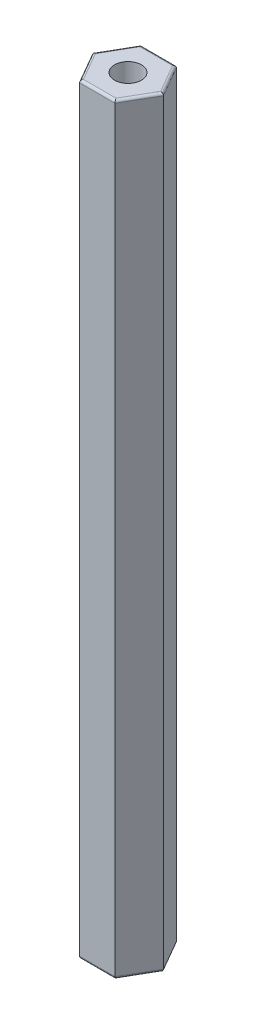
ISO-10303-21;
HEADER;
FILE_DESCRIPTION(('STEP AP214'),'2;1');
FILE_NAME('part.step','',(''),(''),'','','');
FILE_SCHEMA(('AUTOMOTIVE_DESIGN { 1 0 10303 214 1 1 1 1 }'));
ENDSEC;
DATA;
#1=APPLICATION_CONTEXT('core data for automotive mechanical design processes');
#2=APPLICATION_PROTOCOL_DEFINITION('international standard','automotive_design',2000,#1);
#3=PRODUCT_CONTEXT('',#1,'mechanical');
#4=PRODUCT('Part','Part','',(#3));
#5=PRODUCT_RELATED_PRODUCT_CATEGORY('part','',(#4));
#6=PRODUCT_DEFINITION_FORMATION('','',#4);
#7=PRODUCT_DEFINITION_CONTEXT('part definition',#1,'design');
#8=PRODUCT_DEFINITION('design','',#6,#7);
#9=PRODUCT_DEFINITION_SHAPE('','',#8);
#10=(LENGTH_UNIT() NAMED_UNIT(*) SI_UNIT(.MILLI.,.METRE.));
#11=(NAMED_UNIT(*) PLANE_ANGLE_UNIT() SI_UNIT($,.RADIAN.));
#12=(NAMED_UNIT(*) SI_UNIT($,.STERADIAN.) SOLID_ANGLE_UNIT());
#13=UNCERTAINTY_MEASURE_WITH_UNIT(LENGTH_MEASURE(1.E-05),#10,'distance_accuracy_value','');
#14=(GEOMETRIC_REPRESENTATION_CONTEXT(3) GLOBAL_UNCERTAINTY_ASSIGNED_CONTEXT((#13)) GLOBAL_UNIT_ASSIGNED_CONTEXT((#10,
#11,#12)) REPRESENTATION_CONTEXT('',''));
#15=CARTESIAN_POINT('',(0.,0.,0.));
#16=DIRECTION('',(0.,0.,1.));
#17=DIRECTION('',(1.,0.,0.));
#18=AXIS2_PLACEMENT_3D('',#15,#16,#17);
#19=CARTESIAN_POINT('',(1.44337567297406,62.,2.5));
#20=DIRECTION('',(-0.866025403784439,0.,-0.5));
#21=DIRECTION('',(-0.5,0.,0.866025403784439));
#22=AXIS2_PLACEMENT_3D('',#19,#20,#21);
#23=PLANE('',#22);
#24=DIRECTION('',(0.,-1.,0.));
#25=VECTOR('',#24,1.);
#26=CARTESIAN_POINT('',(2.88675134594813,62.,0.));
#27=LINE('',#26,#25);
#28=CARTESIAN_POINT('',(2.88675134594813,61.8,0.));
#29=VERTEX_POINT('',#28);
#30=CARTESIAN_POINT('',(2.88675134594813,0.200000000000006,0.));
#31=VERTEX_POINT('',#30);
#32=EDGE_CURVE('E151',#29,#31,#27,.T.);
#33=ORIENTED_EDGE('',*,*,#32,.F.);
#34=DIRECTION('',(0.5,0.,-0.866025403784439));
#35=VECTOR('',#34,1.);
#36=CARTESIAN_POINT('',(1.44337567297406,61.8,2.5));
#37=LINE('',#36,#35);
#38=CARTESIAN_POINT('',(1.44337567297406,61.8,2.5));
#39=VERTEX_POINT('',#38);
#40=EDGE_CURVE('E142',#29,#39,#37,.F.);
#41=ORIENTED_EDGE('',*,*,#40,.T.);
#42=DIRECTION('',(0.,-1.,0.));
#43=VECTOR('',#42,1.);
#44=CARTESIAN_POINT('',(1.44337567297406,62.,2.5));
#45=LINE('',#44,#43);
#46=CARTESIAN_POINT('',(1.44337567297406,0.200000000000006,2.5));
#47=VERTEX_POINT('',#46);
#48=EDGE_CURVE('E208',#39,#47,#45,.T.);
#49=ORIENTED_EDGE('',*,*,#48,.T.);
#50=DIRECTION('',(0.5,0.,-0.866025403784439));
#51=VECTOR('',#50,1.);
#52=CARTESIAN_POINT('',(1.44337567297406,0.199999999999999,2.5));
#53=LINE('',#52,#51);
#54=EDGE_CURVE('E183',#47,#31,#53,.T.);
#55=ORIENTED_EDGE('',*,*,#54,.T.);
#56=EDGE_LOOP('',(#33,#41,#49,#55));
#57=FACE_BOUND('',#56,.T.);
#58=ADVANCED_FACE('F35',(#57),#23,.F.);
#59=CARTESIAN_POINT('',(2.88675134594813,62.,0.));
#60=DIRECTION('',(-0.866025403784439,0.,0.5));
#61=DIRECTION('',(0.5,0.,0.866025403784439));
#62=AXIS2_PLACEMENT_3D('',#59,#60,#61);
#63=PLANE('',#62);
#64=DIRECTION('',(0.,-1.,0.));
#65=VECTOR('',#64,1.);
#66=CARTESIAN_POINT('',(1.44337567297406,62.,-2.5));
#67=LINE('',#66,#65);
#68=CARTESIAN_POINT('',(1.44337567297406,61.8,-2.5));
#69=VERTEX_POINT('',#68);
#70=CARTESIAN_POINT('',(1.44337567297406,0.200000000000006,-2.5));
#71=VERTEX_POINT('',#70);
#72=EDGE_CURVE('E154',#69,#71,#67,.T.);
#73=ORIENTED_EDGE('',*,*,#72,.F.);
#74=DIRECTION('',(-0.5,0.,-0.866025403784439));
#75=VECTOR('',#74,1.);
#76=CARTESIAN_POINT('',(2.88675134594813,61.8,0.));
#77=LINE('',#76,#75);
#78=EDGE_CURVE('E188',#69,#29,#77,.F.);
#79=ORIENTED_EDGE('',*,*,#78,.T.);
#80=ORIENTED_EDGE('',*,*,#32,.T.);
#81=DIRECTION('',(-0.5,0.,-0.866025403784439));
#82=VECTOR('',#81,1.);
#83=CARTESIAN_POINT('',(2.88675134594813,0.199999999999999,0.));
#84=LINE('',#83,#82);
#85=EDGE_CURVE('E186',#31,#71,#84,.T.);
#86=ORIENTED_EDGE('',*,*,#85,.T.);
#87=EDGE_LOOP('',(#73,#79,#80,#86));
#88=FACE_BOUND('',#87,.T.);
#89=ADVANCED_FACE('F270',(#88),#63,.F.);
#90=CARTESIAN_POINT('',(1.44337567297406,62.,-2.5));
#91=DIRECTION('',(0.,0.,1.));
#92=DIRECTION('',(1.,0.,0.));
#93=AXIS2_PLACEMENT_3D('',#90,#91,#92);
#94=PLANE('',#93);
#95=DIRECTION('',(0.,-1.,0.));
#96=VECTOR('',#95,1.);
#97=CARTESIAN_POINT('',(-1.44337567297406,62.,-2.5));
#98=LINE('',#97,#96);
#99=CARTESIAN_POINT('',(-1.44337567297406,61.8,-2.5));
#100=VERTEX_POINT('',#99);
#101=CARTESIAN_POINT('',(-1.44337567297406,0.200000000000006,-2.5));
#102=VERTEX_POINT('',#101);
#103=EDGE_CURVE('E261',#100,#102,#98,.T.);
#104=ORIENTED_EDGE('',*,*,#103,.F.);
#105=DIRECTION('',(-1.,0.,0.));
#106=VECTOR('',#105,1.);
#107=CARTESIAN_POINT('',(1.44337567297406,61.8,-2.5));
#108=LINE('',#107,#106);
#109=EDGE_CURVE('E167',#100,#69,#108,.F.);
#110=ORIENTED_EDGE('',*,*,#109,.T.);
#111=ORIENTED_EDGE('',*,*,#72,.T.);
#112=DIRECTION('',(-1.,0.,0.));
#113=VECTOR('',#112,1.);
#114=CARTESIAN_POINT('',(1.44337567297406,0.199999999999999,-2.5));
#115=LINE('',#114,#113);
#116=EDGE_CURVE('E165',#71,#102,#115,.T.);
#117=ORIENTED_EDGE('',*,*,#116,.T.);
#118=EDGE_LOOP('',(#104,#110,#111,#117));
#119=FACE_BOUND('',#118,.T.);
#120=ADVANCED_FACE('F267',(#119),#94,.F.);
#121=CARTESIAN_POINT('',(-1.44337567297406,62.,-2.5));
#122=DIRECTION('',(0.866025403784439,0.,0.5));
#123=DIRECTION('',(0.5,0.,-0.866025403784439));
#124=AXIS2_PLACEMENT_3D('',#121,#122,#123);
#125=PLANE('',#124);
#126=DIRECTION('',(0.,-1.,0.));
#127=VECTOR('',#126,1.);
#128=CARTESIAN_POINT('',(-2.88675134594813,62.,0.));
#129=LINE('',#128,#127);
#130=CARTESIAN_POINT('',(-2.88675134594813,61.8,0.));
#131=VERTEX_POINT('',#130);
#132=CARTESIAN_POINT('',(-2.88675134594813,0.200000000000006,0.));
#133=VERTEX_POINT('',#132);
#134=EDGE_CURVE('E253',#131,#133,#129,.T.);
#135=ORIENTED_EDGE('',*,*,#134,.F.);
#136=DIRECTION('',(-0.5,0.,0.866025403784439));
#137=VECTOR('',#136,1.);
#138=CARTESIAN_POINT('',(-1.44337567297406,61.8,-2.5));
#139=LINE('',#138,#137);
#140=EDGE_CURVE('E172',#131,#100,#139,.F.);
#141=ORIENTED_EDGE('',*,*,#140,.T.);
#142=ORIENTED_EDGE('',*,*,#103,.T.);
#143=DIRECTION('',(-0.5,0.,0.866025403784439));
#144=VECTOR('',#143,1.);
#145=CARTESIAN_POINT('',(-1.44337567297406,0.199999999999999,-2.5));
#146=LINE('',#145,#144);
#147=EDGE_CURVE('E170',#102,#133,#146,.T.);
#148=ORIENTED_EDGE('',*,*,#147,.T.);
#149=EDGE_LOOP('',(#135,#141,#142,#148));
#150=FACE_BOUND('',#149,.T.);
#151=ADVANCED_FACE('F277',(#150),#125,.F.);
#152=CARTESIAN_POINT('',(-2.88675134594813,62.,0.));
#153=DIRECTION('',(0.866025403784439,0.,-0.5));
#154=DIRECTION('',(-0.5,0.,-0.866025403784439));
#155=AXIS2_PLACEMENT_3D('',#152,#153,#154);
#156=PLANE('',#155);
#157=DIRECTION('',(0.,-1.,0.));
#158=VECTOR('',#157,1.);
#159=CARTESIAN_POINT('',(-1.44337567297406,62.,2.5));
#160=LINE('',#159,#158);
#161=CARTESIAN_POINT('',(-1.44337567297406,61.8,2.5));
#162=VERTEX_POINT('',#161);
#163=CARTESIAN_POINT('',(-1.44337567297406,0.200000000000006,2.5));
#164=VERTEX_POINT('',#163);
#165=EDGE_CURVE('E249',#162,#164,#160,.T.);
#166=ORIENTED_EDGE('',*,*,#165,.F.);
#167=DIRECTION('',(0.5,0.,0.866025403784439));
#168=VECTOR('',#167,1.);
#169=CARTESIAN_POINT('',(-2.88675134594813,61.8,0.));
#170=LINE('',#169,#168);
#171=EDGE_CURVE('E176',#162,#131,#170,.F.);
#172=ORIENTED_EDGE('',*,*,#171,.T.);
#173=ORIENTED_EDGE('',*,*,#134,.T.);
#174=DIRECTION('',(0.5,0.,0.866025403784439));
#175=VECTOR('',#174,1.);
#176=CARTESIAN_POINT('',(-2.88675134594813,0.199999999999999,0.));
#177=LINE('',#176,#175);
#178=EDGE_CURVE('E174',#133,#164,#177,.T.);
#179=ORIENTED_EDGE('',*,*,#178,.T.);
#180=EDGE_LOOP('',(#166,#172,#173,#179));
#181=FACE_BOUND('',#180,.T.);
#182=ADVANCED_FACE('F366',(#181),#156,.F.);
#183=CARTESIAN_POINT('',(-1.44337567297406,62.,2.5));
#184=DIRECTION('',(0.,0.,-1.));
#185=DIRECTION('',(-1.,0.,0.));
#186=AXIS2_PLACEMENT_3D('',#183,#184,#185);
#187=PLANE('',#186);
#188=ORIENTED_EDGE('',*,*,#48,.F.);
#189=DIRECTION('',(1.,0.,0.));
#190=VECTOR('',#189,1.);
#191=CARTESIAN_POINT('',(-1.44337567297406,61.8,2.5));
#192=LINE('',#191,#190);
#193=EDGE_CURVE('E181',#39,#162,#192,.F.);
#194=ORIENTED_EDGE('',*,*,#193,.T.);
#195=ORIENTED_EDGE('',*,*,#165,.T.);
#196=DIRECTION('',(1.,0.,0.));
#197=VECTOR('',#196,1.);
#198=CARTESIAN_POINT('',(-1.44337567297406,0.199999999999999,2.5));
#199=LINE('',#198,#197);
#200=EDGE_CURVE('E178',#164,#47,#199,.T.);
#201=ORIENTED_EDGE('',*,*,#200,.T.);
#202=EDGE_LOOP('',(#188,#194,#195,#201));
#203=FACE_BOUND('',#202,.T.);
#204=ADVANCED_FACE('F246',(#203),#187,.F.);
#205=CARTESIAN_POINT('',(2.88675134594813,62.,0.));
#206=DIRECTION('',(0.,1.,0.));
#207=DIRECTION('',(0.,0.,1.));
#208=AXIS2_PLACEMENT_3D('',#205,#206,#207);
#209=PLANE('',#208);
#210=CARTESIAN_POINT('',(0.,62.,0.));
#211=DIRECTION('',(0.,1.,0.));
#212=DIRECTION('',(0.,0.,1.));
#213=AXIS2_PLACEMENT_3D('',#210,#211,#212);
#214=CIRCLE('',#213,1.0922);
#215=CARTESIAN_POINT('',(0.,62.,1.0922));
#216=VERTEX_POINT('',#215);
#217=EDGE_CURVE('E256',#216,#216,#214,.T.);
#218=ORIENTED_EDGE('',*,*,#217,.F.);
#219=EDGE_LOOP('',(#218));
#220=FACE_BOUND('',#219,.T.);
#221=DIRECTION('',(-0.5,0.,-0.866025403784439));
#222=VECTOR('',#221,1.);
#223=CARTESIAN_POINT('',(1.27017059221718,62.,-2.4));
#224=LINE('',#223,#222);
#225=CARTESIAN_POINT('',(2.65581123827228,62.,0.));
#226=VERTEX_POINT('',#225);
#227=CARTESIAN_POINT('',(1.32790561913614,62.,-2.3));
#228=VERTEX_POINT('',#227);
#229=EDGE_CURVE('E130',#226,#228,#224,.T.);
#230=ORIENTED_EDGE('',*,*,#229,.T.);
#231=DIRECTION('',(-1.,0.,0.));
#232=VECTOR('',#231,1.);
#233=CARTESIAN_POINT('',(-1.44337567297406,62.,-2.3));
#234=LINE('',#233,#232);
#235=CARTESIAN_POINT('',(-1.32790561913614,62.,-2.3));
#236=VERTEX_POINT('',#235);
#237=EDGE_CURVE('E163',#228,#236,#234,.T.);
#238=ORIENTED_EDGE('',*,*,#237,.T.);
#239=DIRECTION('',(-0.5,0.,0.866025403784439));
#240=VECTOR('',#239,1.);
#241=CARTESIAN_POINT('',(-2.71354626519124,62.,0.100000000000001));
#242=LINE('',#241,#240);
#243=CARTESIAN_POINT('',(-2.65581123827228,62.,0.));
#244=VERTEX_POINT('',#243);
#245=EDGE_CURVE('E161',#236,#244,#242,.T.);
#246=ORIENTED_EDGE('',*,*,#245,.T.);
#247=DIRECTION('',(0.5,0.,0.866025403784439));
#248=VECTOR('',#247,1.);
#249=CARTESIAN_POINT('',(-1.27017059221718,62.,2.4));
#250=LINE('',#249,#248);
#251=CARTESIAN_POINT('',(-1.32790561913614,62.,2.3));
#252=VERTEX_POINT('',#251);
#253=EDGE_CURVE('E159',#244,#252,#250,.T.);
#254=ORIENTED_EDGE('',*,*,#253,.T.);
#255=DIRECTION('',(1.,0.,0.));
#256=VECTOR('',#255,1.);
#257=CARTESIAN_POINT('',(1.44337567297406,62.,2.3));
#258=LINE('',#257,#256);
#259=CARTESIAN_POINT('',(1.32790561913614,62.,2.3));
#260=VERTEX_POINT('',#259);
#261=EDGE_CURVE('E133',#252,#260,#258,.T.);
#262=ORIENTED_EDGE('',*,*,#261,.T.);
#263=DIRECTION('',(0.5,0.,-0.866025403784439));
#264=VECTOR('',#263,1.);
#265=CARTESIAN_POINT('',(2.71354626519124,62.,-0.100000000000001));
#266=LINE('',#265,#264);
#267=EDGE_CURVE('E125',#260,#226,#266,.T.);
#268=ORIENTED_EDGE('',*,*,#267,.T.);
#269=EDGE_LOOP('',(#230,#238,#246,#254,#262,#268));
#270=FACE_BOUND('',#269,.T.);
#271=ADVANCED_FACE('F127',(#220,#270),#209,.T.);
#272=CARTESIAN_POINT('',(2.88675134594813,0.,0.));
#273=DIRECTION('',(0.,1.,0.));
#274=DIRECTION('',(0.,0.,1.));
#275=AXIS2_PLACEMENT_3D('',#272,#273,#274);
#276=PLANE('',#275);
#277=CARTESIAN_POINT('',(0.,0.,0.));
#278=DIRECTION('',(0.,-1.,0.));
#279=DIRECTION('',(0.,0.,-1.));
#280=AXIS2_PLACEMENT_3D('',#277,#278,#279);
#281=CIRCLE('',#280,1.0922);
#282=CARTESIAN_POINT('',(0.,0.,-1.0922));
#283=VERTEX_POINT('',#282);
#284=EDGE_CURVE('E488',#283,#283,#281,.T.);
#285=ORIENTED_EDGE('',*,*,#284,.F.);
#286=EDGE_LOOP('',(#285));
#287=FACE_BOUND('',#286,.T.);
#288=DIRECTION('',(0.5,0.,-0.866025403784439));
#289=VECTOR('',#288,1.);
#290=CARTESIAN_POINT('',(2.71354626519124,0.,-0.100000000000001));
#291=LINE('',#290,#289);
#292=CARTESIAN_POINT('',(2.65581123827228,0.,0.));
#293=VERTEX_POINT('',#292);
#294=CARTESIAN_POINT('',(1.32790561913614,0.,2.3));
#295=VERTEX_POINT('',#294);
#296=EDGE_CURVE('E190',#293,#295,#291,.F.);
#297=ORIENTED_EDGE('',*,*,#296,.T.);
#298=DIRECTION('',(1.,0.,0.));
#299=VECTOR('',#298,1.);
#300=CARTESIAN_POINT('',(2.88675134594813,0.,2.3));
#301=LINE('',#300,#299);
#302=CARTESIAN_POINT('',(-1.32790561913614,0.,2.3));
#303=VERTEX_POINT('',#302);
#304=EDGE_CURVE('E11',#295,#303,#301,.F.);
#305=ORIENTED_EDGE('',*,*,#304,.T.);
#306=DIRECTION('',(0.5,0.,0.866025403784439));
#307=VECTOR('',#306,1.);
#308=CARTESIAN_POINT('',(-1.27017059221718,0.,2.4));
#309=LINE('',#308,#307);
#310=CARTESIAN_POINT('',(-2.65581123827228,0.,0.));
#311=VERTEX_POINT('',#310);
#312=EDGE_CURVE('E44',#303,#311,#309,.F.);
#313=ORIENTED_EDGE('',*,*,#312,.T.);
#314=DIRECTION('',(-0.5,0.,0.866025403784439));
#315=VECTOR('',#314,1.);
#316=CARTESIAN_POINT('',(-1.27017059221718,0.,-2.4));
#317=LINE('',#316,#315);
#318=CARTESIAN_POINT('',(-1.32790561913614,0.,-2.3));
#319=VERTEX_POINT('',#318);
#320=EDGE_CURVE('E196',#311,#319,#317,.F.);
#321=ORIENTED_EDGE('',*,*,#320,.T.);
#322=DIRECTION('',(-1.,0.,0.));
#323=VECTOR('',#322,1.);
#324=CARTESIAN_POINT('',(2.88675134594813,0.,-2.3));
#325=LINE('',#324,#323);
#326=CARTESIAN_POINT('',(1.32790561913614,0.,-2.3));
#327=VERTEX_POINT('',#326);
#328=EDGE_CURVE('E194',#319,#327,#325,.F.);
#329=ORIENTED_EDGE('',*,*,#328,.T.);
#330=DIRECTION('',(-0.5,0.,-0.866025403784439));
#331=VECTOR('',#330,1.);
#332=CARTESIAN_POINT('',(2.71354626519124,0.,0.0999999999999995));
#333=LINE('',#332,#331);
#334=EDGE_CURVE('E192',#327,#293,#333,.F.);
#335=ORIENTED_EDGE('',*,*,#334,.T.);
#336=EDGE_LOOP('',(#297,#305,#313,#321,#329,#335));
#337=FACE_BOUND('',#336,.T.);
#338=ADVANCED_FACE('F233',(#287,#337),#276,.F.);
#339=CARTESIAN_POINT('',(2.88675134594813,61.8,2.3));
#340=DIRECTION('',(-1.,0.,0.));
#341=DIRECTION('',(0.,0.,1.));
#342=AXIS2_PLACEMENT_3D('',#339,#340,#341);
#343=CYLINDRICAL_SURFACE('',#342,0.2);
#344=CARTESIAN_POINT('',(-1.32790561913614,61.8,2.3));
#345=DIRECTION('',(-0.866025403784439,0.,-0.5));
#346=DIRECTION('',(-0.5,0.,0.866025403784439));
#347=AXIS2_PLACEMENT_3D('',#344,#345,#346);
#348=ELLIPSE('',#347,0.23094010767585,0.2);
#349=EDGE_CURVE('E145',#162,#252,#348,.T.);
#350=ORIENTED_EDGE('',*,*,#349,.F.);
#351=ORIENTED_EDGE('',*,*,#193,.F.);
#352=CARTESIAN_POINT('',(1.32790561913614,61.8,2.3));
#353=DIRECTION('',(-0.866025403784438,0.,0.5));
#354=DIRECTION('',(0.5,0.,0.866025403784439));
#355=AXIS2_PLACEMENT_3D('',#352,#353,#354);
#356=ELLIPSE('',#355,0.23094010767585,0.2);
#357=EDGE_CURVE('E206',#260,#39,#356,.F.);
#358=ORIENTED_EDGE('',*,*,#357,.F.);
#359=ORIENTED_EDGE('',*,*,#261,.F.);
#360=EDGE_LOOP('',(#350,#351,#358,#359));
#361=FACE_BOUND('',#360,.T.);
#362=ADVANCED_FACE('F298',(#361),#343,.T.);
#363=CARTESIAN_POINT('',(2.71354626519124,61.8,-0.100000000000001));
#364=DIRECTION('',(-0.5,0.,0.866025403784439));
#365=DIRECTION('',(0.866025403784439,0.,0.5));
#366=AXIS2_PLACEMENT_3D('',#363,#364,#365);
#367=CYLINDRICAL_SURFACE('',#366,0.2);
#368=ORIENTED_EDGE('',*,*,#357,.T.);
#369=ORIENTED_EDGE('',*,*,#40,.F.);
#370=CARTESIAN_POINT('',(2.65581123827228,61.8,0.));
#371=DIRECTION('',(0.,0.,1.));
#372=DIRECTION('',(1.,0.,0.));
#373=AXIS2_PLACEMENT_3D('',#370,#371,#372);
#374=ELLIPSE('',#373,0.23094010767585,0.2);
#375=EDGE_CURVE('E140',#226,#29,#374,.F.);
#376=ORIENTED_EDGE('',*,*,#375,.F.);
#377=ORIENTED_EDGE('',*,*,#267,.F.);
#378=EDGE_LOOP('',(#368,#369,#376,#377));
#379=FACE_BOUND('',#378,.T.);
#380=ADVANCED_FACE('F141',(#379),#367,.T.);
#381=CARTESIAN_POINT('',(-1.27017059221718,61.8,2.4));
#382=DIRECTION('',(-0.5,0.,-0.866025403784439));
#383=DIRECTION('',(-0.866025403784439,0.,0.5));
#384=AXIS2_PLACEMENT_3D('',#381,#382,#383);
#385=CYLINDRICAL_SURFACE('',#384,0.2);
#386=ORIENTED_EDGE('',*,*,#349,.T.);
#387=ORIENTED_EDGE('',*,*,#253,.F.);
#388=CARTESIAN_POINT('',(-2.65581123827228,61.8,0.));
#389=DIRECTION('',(0.,0.,-1.));
#390=DIRECTION('',(-1.,0.,0.));
#391=AXIS2_PLACEMENT_3D('',#388,#389,#390);
#392=ELLIPSE('',#391,0.23094010767585,0.2);
#393=EDGE_CURVE('E146',#131,#244,#392,.T.);
#394=ORIENTED_EDGE('',*,*,#393,.F.);
#395=ORIENTED_EDGE('',*,*,#171,.F.);
#396=EDGE_LOOP('',(#386,#387,#394,#395));
#397=FACE_BOUND('',#396,.T.);
#398=ADVANCED_FACE('F292',(#397),#385,.T.);
#399=CARTESIAN_POINT('',(2.71354626519124,61.8,0.0999999999999994));
#400=DIRECTION('',(0.5,0.,0.866025403784439));
#401=DIRECTION('',(0.866025403784439,0.,-0.5));
#402=AXIS2_PLACEMENT_3D('',#399,#400,#401);
#403=CYLINDRICAL_SURFACE('',#402,0.2);
#404=ORIENTED_EDGE('',*,*,#375,.T.);
#405=ORIENTED_EDGE('',*,*,#78,.F.);
#406=CARTESIAN_POINT('',(1.32790561913614,61.8,-2.3));
#407=DIRECTION('',(0.866025403784439,0.,0.5));
#408=DIRECTION('',(-0.5,0.,0.866025403784439));
#409=AXIS2_PLACEMENT_3D('',#406,#407,#408);
#410=ELLIPSE('',#409,0.23094010767585,0.2);
#411=EDGE_CURVE('E149',#228,#69,#410,.F.);
#412=ORIENTED_EDGE('',*,*,#411,.F.);
#413=ORIENTED_EDGE('',*,*,#229,.F.);
#414=EDGE_LOOP('',(#404,#405,#412,#413));
#415=FACE_BOUND('',#414,.T.);
#416=ADVANCED_FACE('F148',(#415),#403,.T.);
#417=CARTESIAN_POINT('',(-1.27017059221718,61.8,-2.4));
#418=DIRECTION('',(0.5,0.,-0.866025403784439));
#419=DIRECTION('',(-0.866025403784439,0.,-0.5));
#420=AXIS2_PLACEMENT_3D('',#417,#418,#419);
#421=CYLINDRICAL_SURFACE('',#420,0.2);
#422=ORIENTED_EDGE('',*,*,#393,.T.);
#423=ORIENTED_EDGE('',*,*,#245,.F.);
#424=CARTESIAN_POINT('',(-1.32790561913614,61.8,-2.3));
#425=DIRECTION('',(0.866025403784439,0.,-0.5));
#426=DIRECTION('',(-0.5,0.,-0.866025403784439));
#427=AXIS2_PLACEMENT_3D('',#424,#425,#426);
#428=ELLIPSE('',#427,0.23094010767585,0.2);
#429=EDGE_CURVE('E199',#100,#236,#428,.T.);
#430=ORIENTED_EDGE('',*,*,#429,.F.);
#431=ORIENTED_EDGE('',*,*,#140,.F.);
#432=EDGE_LOOP('',(#422,#423,#430,#431));
#433=FACE_BOUND('',#432,.T.);
#434=ADVANCED_FACE('F285',(#433),#421,.T.);
#435=CARTESIAN_POINT('',(2.88675134594813,61.8,-2.3));
#436=DIRECTION('',(1.,0.,0.));
#437=DIRECTION('',(0.,0.,-1.));
#438=AXIS2_PLACEMENT_3D('',#435,#436,#437);
#439=CYLINDRICAL_SURFACE('',#438,0.2);
#440=ORIENTED_EDGE('',*,*,#411,.T.);
#441=ORIENTED_EDGE('',*,*,#109,.F.);
#442=ORIENTED_EDGE('',*,*,#429,.T.);
#443=ORIENTED_EDGE('',*,*,#237,.F.);
#444=EDGE_LOOP('',(#440,#441,#442,#443));
#445=FACE_BOUND('',#444,.T.);
#446=ADVANCED_FACE('F282',(#445),#439,.T.);
#447=CARTESIAN_POINT('',(1.44337567297406,0.199999999999999,-2.3));
#448=DIRECTION('',(-1.,0.,0.));
#449=DIRECTION('',(0.,0.,1.));
#450=AXIS2_PLACEMENT_3D('',#447,#448,#449);
#451=CYLINDRICAL_SURFACE('',#450,0.2);
#452=CARTESIAN_POINT('',(1.32790561913614,0.199999999999999,-2.3));
#453=DIRECTION('',(-0.866025403784439,0.,-0.5));
#454=DIRECTION('',(0.5,0.,-0.866025403784439));
#455=AXIS2_PLACEMENT_3D('',#452,#453,#454);
#456=ELLIPSE('',#455,0.23094010767585,0.2);
#457=EDGE_CURVE('E218',#327,#71,#456,.F.);
#458=ORIENTED_EDGE('',*,*,#457,.F.);
#459=ORIENTED_EDGE('',*,*,#328,.F.);
#460=CARTESIAN_POINT('',(-1.32790561913614,0.199999999999999,-2.3));
#461=DIRECTION('',(-0.866025403784439,0.,0.5));
#462=DIRECTION('',(-0.5,0.,-0.866025403784439));
#463=AXIS2_PLACEMENT_3D('',#460,#461,#462);
#464=ELLIPSE('',#463,0.23094010767585,0.2);
#465=EDGE_CURVE('E39',#102,#319,#464,.T.);
#466=ORIENTED_EDGE('',*,*,#465,.F.);
#467=ORIENTED_EDGE('',*,*,#116,.F.);
#468=EDGE_LOOP('',(#458,#459,#466,#467));
#469=FACE_BOUND('',#468,.T.);
#470=ADVANCED_FACE('F37',(#469),#451,.T.);
#471=CARTESIAN_POINT('',(-1.27017059221718,0.199999999999999,-2.4));
#472=DIRECTION('',(-0.5,0.,0.866025403784439));
#473=DIRECTION('',(0.866025403784439,0.,0.5));
#474=AXIS2_PLACEMENT_3D('',#471,#472,#473);
#475=CYLINDRICAL_SURFACE('',#474,0.2);
#476=ORIENTED_EDGE('',*,*,#465,.T.);
#477=ORIENTED_EDGE('',*,*,#320,.F.);
#478=CARTESIAN_POINT('',(-2.65581123827228,0.199999999999999,0.));
#479=DIRECTION('',(0.,0.,1.));
#480=DIRECTION('',(-1.,0.,0.));
#481=AXIS2_PLACEMENT_3D('',#478,#479,#480);
#482=ELLIPSE('',#481,0.23094010767585,0.2);
#483=EDGE_CURVE('E216',#133,#311,#482,.T.);
#484=ORIENTED_EDGE('',*,*,#483,.F.);
#485=ORIENTED_EDGE('',*,*,#147,.F.);
#486=EDGE_LOOP('',(#476,#477,#484,#485));
#487=FACE_BOUND('',#486,.T.);
#488=ADVANCED_FACE('F228',(#487),#475,.T.);
#489=CARTESIAN_POINT('',(2.71354626519124,0.199999999999999,0.0999999999999992));
#490=DIRECTION('',(-0.5,0.,-0.866025403784439));
#491=DIRECTION('',(-0.866025403784439,0.,0.5));
#492=AXIS2_PLACEMENT_3D('',#489,#490,#491);
#493=CYLINDRICAL_SURFACE('',#492,0.2);
#494=ORIENTED_EDGE('',*,*,#457,.T.);
#495=ORIENTED_EDGE('',*,*,#85,.F.);
#496=CARTESIAN_POINT('',(2.65581123827228,0.199999999999999,0.));
#497=DIRECTION('',(0.,0.,-1.));
#498=DIRECTION('',(1.,0.,0.));
#499=AXIS2_PLACEMENT_3D('',#496,#497,#498);
#500=ELLIPSE('',#499,0.23094010767585,0.2);
#501=EDGE_CURVE('E213',#293,#31,#500,.F.);
#502=ORIENTED_EDGE('',*,*,#501,.F.);
#503=ORIENTED_EDGE('',*,*,#334,.F.);
#504=EDGE_LOOP('',(#494,#495,#502,#503));
#505=FACE_BOUND('',#504,.T.);
#506=ADVANCED_FACE('F236',(#505),#493,.T.);
#507=CARTESIAN_POINT('',(-2.71354626519124,0.199999999999999,-0.0999999999999996));
#508=DIRECTION('',(0.5,0.,0.866025403784439));
#509=DIRECTION('',(0.866025403784439,0.,-0.5));
#510=AXIS2_PLACEMENT_3D('',#507,#508,#509);
#511=CYLINDRICAL_SURFACE('',#510,0.2);
#512=ORIENTED_EDGE('',*,*,#483,.T.);
#513=ORIENTED_EDGE('',*,*,#312,.F.);
#514=CARTESIAN_POINT('',(-1.32790561913614,0.199999999999999,2.3));
#515=DIRECTION('',(0.866025403784439,0.,0.5));
#516=DIRECTION('',(-0.5,0.,0.866025403784439));
#517=AXIS2_PLACEMENT_3D('',#514,#515,#516);
#518=ELLIPSE('',#517,0.23094010767585,0.2);
#519=EDGE_CURVE('E52',#164,#303,#518,.T.);
#520=ORIENTED_EDGE('',*,*,#519,.F.);
#521=ORIENTED_EDGE('',*,*,#178,.F.);
#522=EDGE_LOOP('',(#512,#513,#520,#521));
#523=FACE_BOUND('',#522,.T.);
#524=ADVANCED_FACE('F307',(#523),#511,.T.);
#525=CARTESIAN_POINT('',(1.27017059221718,0.199999999999999,2.4));
#526=DIRECTION('',(0.5,0.,-0.866025403784439));
#527=DIRECTION('',(-0.866025403784439,0.,-0.5));
#528=AXIS2_PLACEMENT_3D('',#525,#526,#527);
#529=CYLINDRICAL_SURFACE('',#528,0.2);
#530=ORIENTED_EDGE('',*,*,#501,.T.);
#531=ORIENTED_EDGE('',*,*,#54,.F.);
#532=CARTESIAN_POINT('',(1.32790561913614,0.199999999999999,2.3));
#533=DIRECTION('',(0.866025403784438,0.,-0.5));
#534=DIRECTION('',(-0.5,0.,-0.866025403784439));
#535=AXIS2_PLACEMENT_3D('',#532,#533,#534);
#536=ELLIPSE('',#535,0.23094010767585,0.2);
#537=EDGE_CURVE('E209',#295,#47,#536,.F.);
#538=ORIENTED_EDGE('',*,*,#537,.F.);
#539=ORIENTED_EDGE('',*,*,#296,.F.);
#540=EDGE_LOOP('',(#530,#531,#538,#539));
#541=FACE_BOUND('',#540,.T.);
#542=ADVANCED_FACE('F240',(#541),#529,.T.);
#543=CARTESIAN_POINT('',(-1.44337567297406,0.199999999999999,2.3));
#544=DIRECTION('',(1.,0.,0.));
#545=DIRECTION('',(0.,0.,-1.));
#546=AXIS2_PLACEMENT_3D('',#543,#544,#545);
#547=CYLINDRICAL_SURFACE('',#546,0.2);
#548=ORIENTED_EDGE('',*,*,#519,.T.);
#549=ORIENTED_EDGE('',*,*,#304,.F.);
#550=ORIENTED_EDGE('',*,*,#537,.T.);
#551=ORIENTED_EDGE('',*,*,#200,.F.);
#552=EDGE_LOOP('',(#548,#549,#550,#551));
#553=FACE_BOUND('',#552,.T.);
#554=ADVANCED_FACE('F241',(#553),#547,.T.);
#555=CARTESIAN_POINT('',(0.,57.,0.));
#556=DIRECTION('',(0.,1.,0.));
#557=DIRECTION('',(0.,0.,1.));
#558=AXIS2_PLACEMENT_3D('',#555,#556,#557);
#559=CYLINDRICAL_SURFACE('',#558,1.0922);
#560=CARTESIAN_POINT('',(0.,57.,0.));
#561=DIRECTION('',(0.,1.,0.));
#562=DIRECTION('',(0.,0.,1.));
#563=AXIS2_PLACEMENT_3D('',#560,#561,#562);
#564=CIRCLE('',#563,1.0922);
#565=CARTESIAN_POINT('',(0.,57.,1.0922));
#566=VERTEX_POINT('',#565);
#567=EDGE_CURVE('E211',#566,#566,#564,.T.);
#568=ORIENTED_EDGE('',*,*,#567,.F.);
#569=EDGE_LOOP('',(#568));
#570=FACE_BOUND('',#569,.T.);
#571=ORIENTED_EDGE('',*,*,#217,.T.);
#572=EDGE_LOOP('',(#571));
#573=FACE_BOUND('',#572,.T.);
#574=ADVANCED_FACE('F304',(#570,#573),#559,.F.);
#575=CARTESIAN_POINT('',(0.,57.,0.));
#576=DIRECTION('',(0.,1.,0.));
#577=DIRECTION('',(0.,0.,1.));
#578=AXIS2_PLACEMENT_3D('',#575,#576,#577);
#579=PLANE('',#578);
#580=ORIENTED_EDGE('',*,*,#567,.T.);
#581=EDGE_LOOP('',(#580));
#582=FACE_BOUND('',#581,.T.);
#583=ADVANCED_FACE('F450',(#582),#579,.T.);
#584=CARTESIAN_POINT('',(0.,5.,0.));
#585=DIRECTION('',(0.,-1.,0.));
#586=DIRECTION('',(0.,0.,-1.));
#587=AXIS2_PLACEMENT_3D('',#584,#585,#586);
#588=CYLINDRICAL_SURFACE('',#587,1.0922);
#589=CARTESIAN_POINT('',(0.,5.,0.));
#590=DIRECTION('',(0.,-1.,0.));
#591=DIRECTION('',(0.,0.,-1.));
#592=AXIS2_PLACEMENT_3D('',#589,#590,#591);
#593=CIRCLE('',#592,1.0922);
#594=CARTESIAN_POINT('',(0.,5.,-1.0922));
#595=VERTEX_POINT('',#594);
#596=EDGE_CURVE('E487',#595,#595,#593,.T.);
#597=ORIENTED_EDGE('',*,*,#596,.F.);
#598=EDGE_LOOP('',(#597));
#599=FACE_BOUND('',#598,.T.);
#600=ORIENTED_EDGE('',*,*,#284,.T.);
#601=EDGE_LOOP('',(#600));
#602=FACE_BOUND('',#601,.T.);
#603=ADVANCED_FACE('F458',(#599,#602),#588,.F.);
#604=CARTESIAN_POINT('',(0.,5.,0.));
#605=DIRECTION('',(0.,-1.,0.));
#606=DIRECTION('',(0.,0.,-1.));
#607=AXIS2_PLACEMENT_3D('',#604,#605,#606);
#608=PLANE('',#607);
#609=ORIENTED_EDGE('',*,*,#596,.T.);
#610=EDGE_LOOP('',(#609));
#611=FACE_BOUND('',#610,.T.);
#612=ADVANCED_FACE('F466',(#611),#608,.T.);
#613=CLOSED_SHELL('',(#58,#89,#120,#151,#182,#204,#271,#338,#362,#380,#398,#416,#434,#446,#470,
#488,#506,#524,#542,#554,#574,#583,#603,#612));
#614=MANIFOLD_SOLID_BREP('B2',#613);
#615=ADVANCED_BREP_SHAPE_REPRESENTATION('',(#18,#614),#14);
#616=SHAPE_DEFINITION_REPRESENTATION(#9,#615);
ENDSEC;
END-ISO-10303-21;
